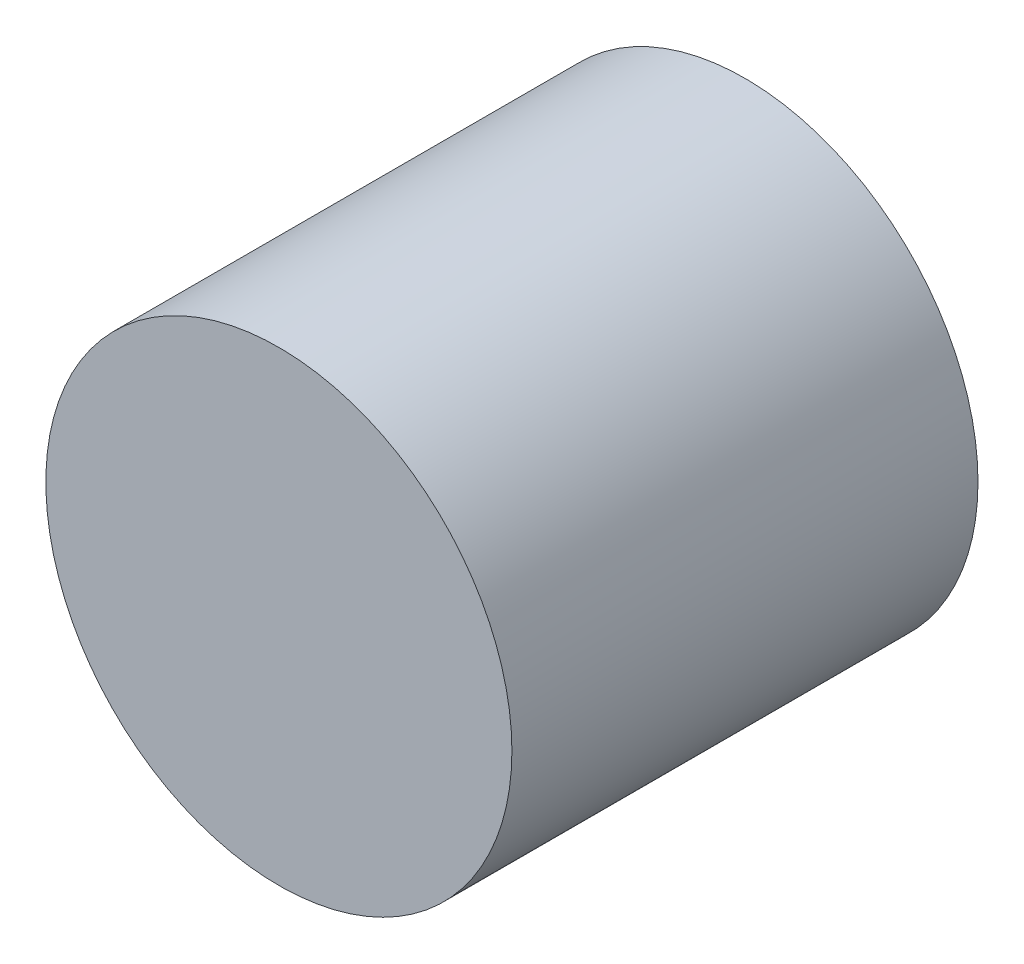
ISO-10303-21;
HEADER;
FILE_DESCRIPTION(('STEP AP214'),'2;1');
FILE_NAME('part.step','',(''),(''),'','','');
FILE_SCHEMA(('AUTOMOTIVE_DESIGN { 1 0 10303 214 1 1 1 1 }'));
ENDSEC;
DATA;
#1=APPLICATION_CONTEXT('core data for automotive mechanical design processes');
#2=APPLICATION_PROTOCOL_DEFINITION('international standard','automotive_design',2000,#1);
#3=PRODUCT_CONTEXT('',#1,'mechanical');
#4=PRODUCT('Part','Part','',(#3));
#5=PRODUCT_RELATED_PRODUCT_CATEGORY('part','',(#4));
#6=PRODUCT_DEFINITION_FORMATION('','',#4);
#7=PRODUCT_DEFINITION_CONTEXT('part definition',#1,'design');
#8=PRODUCT_DEFINITION('design','',#6,#7);
#9=PRODUCT_DEFINITION_SHAPE('','',#8);
#10=(LENGTH_UNIT() NAMED_UNIT(*) SI_UNIT(.MILLI.,.METRE.));
#11=(NAMED_UNIT(*) PLANE_ANGLE_UNIT() SI_UNIT($,.RADIAN.));
#12=(NAMED_UNIT(*) SI_UNIT($,.STERADIAN.) SOLID_ANGLE_UNIT());
#13=UNCERTAINTY_MEASURE_WITH_UNIT(LENGTH_MEASURE(1.E-05),#10,'distance_accuracy_value','');
#14=(GEOMETRIC_REPRESENTATION_CONTEXT(3) GLOBAL_UNCERTAINTY_ASSIGNED_CONTEXT((#13)) GLOBAL_UNIT_ASSIGNED_CONTEXT((#10,
#11,#12)) REPRESENTATION_CONTEXT('',''));
#15=CARTESIAN_POINT('',(0.,0.,0.));
#16=DIRECTION('',(0.,0.,1.));
#17=DIRECTION('',(1.,0.,0.));
#18=AXIS2_PLACEMENT_3D('',#15,#16,#17);
#19=CARTESIAN_POINT('',(0.,0.,2.));
#20=DIRECTION('',(0.,0.,-1.));
#21=DIRECTION('',(-1.,0.,0.));
#22=AXIS2_PLACEMENT_3D('',#19,#20,#21);
#23=CYLINDRICAL_SURFACE('',#22,1.);
#24=CARTESIAN_POINT('',(0.,0.,2.));
#25=DIRECTION('',(0.,0.,1.));
#26=DIRECTION('',(1.,0.,0.));
#27=AXIS2_PLACEMENT_3D('',#24,#25,#26);
#28=CIRCLE('',#27,1.);
#29=CARTESIAN_POINT('',(1.,0.,2.));
#30=VERTEX_POINT('',#29);
#31=EDGE_CURVE('E10',#30,#30,#28,.T.);
#32=ORIENTED_EDGE('',*,*,#31,.F.);
#33=EDGE_LOOP('',(#32));
#34=FACE_BOUND('',#33,.T.);
#35=CARTESIAN_POINT('',(0.,0.,0.));
#36=DIRECTION('',(0.,0.,1.));
#37=DIRECTION('',(1.,0.,0.));
#38=AXIS2_PLACEMENT_3D('',#35,#36,#37);
#39=CIRCLE('',#38,1.);
#40=CARTESIAN_POINT('',(1.,0.,0.));
#41=VERTEX_POINT('',#40);
#42=EDGE_CURVE('E33',#41,#41,#39,.T.);
#43=ORIENTED_EDGE('',*,*,#42,.T.);
#44=EDGE_LOOP('',(#43));
#45=FACE_BOUND('',#44,.T.);
#46=ADVANCED_FACE('F30',(#34,#45),#23,.T.);
#47=CARTESIAN_POINT('',(0.,0.,2.));
#48=DIRECTION('',(0.,0.,1.));
#49=DIRECTION('',(1.,0.,0.));
#50=AXIS2_PLACEMENT_3D('',#47,#48,#49);
#51=PLANE('',#50);
#52=ORIENTED_EDGE('',*,*,#31,.T.);
#53=EDGE_LOOP('',(#52));
#54=FACE_BOUND('',#53,.T.);
#55=ADVANCED_FACE('F45',(#54),#51,.T.);
#56=CARTESIAN_POINT('',(0.,0.,0.));
#57=DIRECTION('',(0.,0.,1.));
#58=DIRECTION('',(1.,0.,0.));
#59=AXIS2_PLACEMENT_3D('',#56,#57,#58);
#60=PLANE('',#59);
#61=ORIENTED_EDGE('',*,*,#42,.F.);
#62=EDGE_LOOP('',(#61));
#63=FACE_BOUND('',#62,.T.);
#64=ADVANCED_FACE('F43',(#63),#60,.F.);
#65=CLOSED_SHELL('',(#46,#55,#64));
#66=MANIFOLD_SOLID_BREP('B2',#65);
#67=ADVANCED_BREP_SHAPE_REPRESENTATION('',(#18,#66),#14);
#68=SHAPE_DEFINITION_REPRESENTATION(#9,#67);
ENDSEC;
END-ISO-10303-21;
